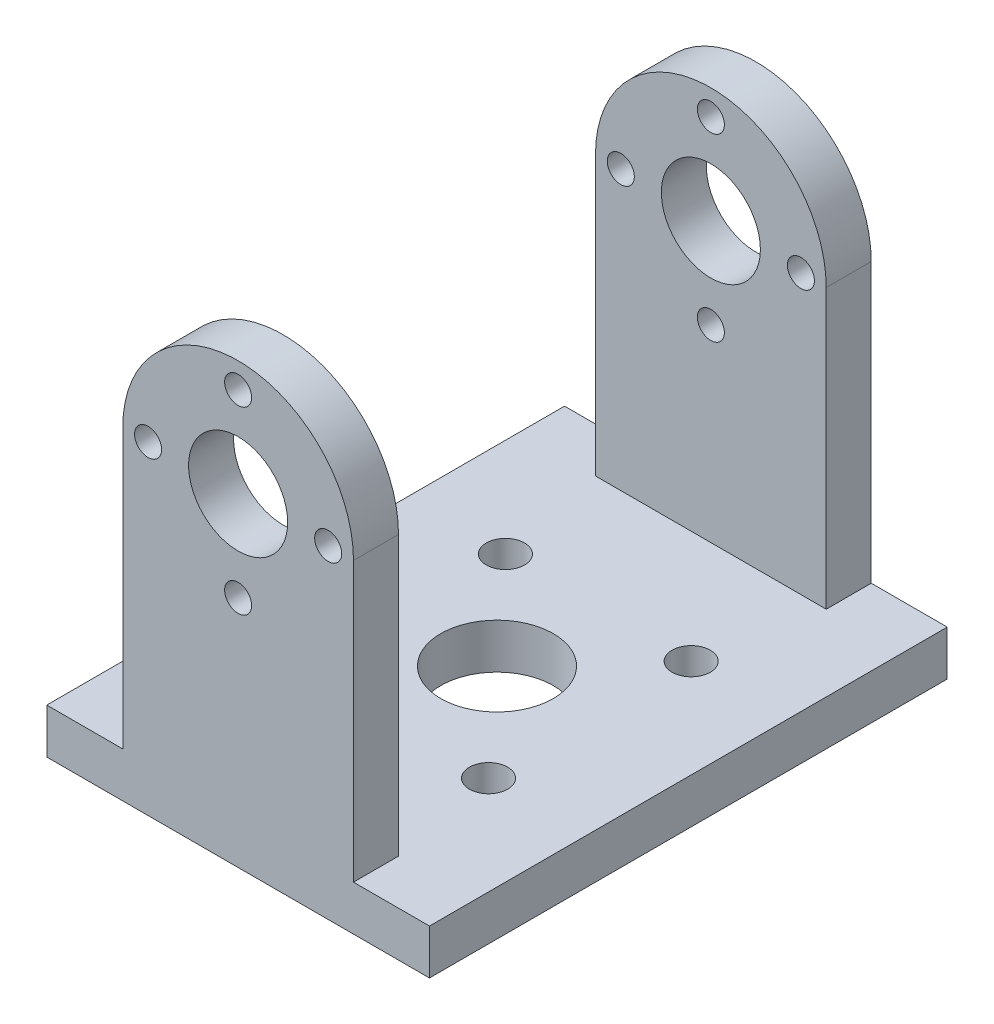
ISO-10303-21;
HEADER;
FILE_DESCRIPTION(('STEP AP214'),'2;1');
FILE_NAME('part.step','',(''),(''),'','','');
FILE_SCHEMA(('AUTOMOTIVE_DESIGN { 1 0 10303 214 1 1 1 1 }'));
ENDSEC;
DATA;
#1=APPLICATION_CONTEXT('core data for automotive mechanical design processes');
#2=APPLICATION_PROTOCOL_DEFINITION('international standard','automotive_design',2000,#1);
#3=PRODUCT_CONTEXT('',#1,'mechanical');
#4=PRODUCT('Part','Part','',(#3));
#5=PRODUCT_RELATED_PRODUCT_CATEGORY('part','',(#4));
#6=PRODUCT_DEFINITION_FORMATION('','',#4);
#7=PRODUCT_DEFINITION_CONTEXT('part definition',#1,'design');
#8=PRODUCT_DEFINITION('design','',#6,#7);
#9=PRODUCT_DEFINITION_SHAPE('','',#8);
#10=(LENGTH_UNIT() NAMED_UNIT(*) SI_UNIT(.MILLI.,.METRE.));
#11=(NAMED_UNIT(*) PLANE_ANGLE_UNIT() SI_UNIT($,.RADIAN.));
#12=(NAMED_UNIT(*) SI_UNIT($,.STERADIAN.) SOLID_ANGLE_UNIT());
#13=UNCERTAINTY_MEASURE_WITH_UNIT(LENGTH_MEASURE(1.E-05),#10,'distance_accuracy_value','');
#14=(GEOMETRIC_REPRESENTATION_CONTEXT(3) GLOBAL_UNCERTAINTY_ASSIGNED_CONTEXT((#13)) GLOBAL_UNIT_ASSIGNED_CONTEXT((#10,
#11,#12)) REPRESENTATION_CONTEXT('',''));
#15=CARTESIAN_POINT('',(0.,0.,0.));
#16=DIRECTION('',(0.,0.,1.));
#17=DIRECTION('',(1.,0.,0.));
#18=AXIS2_PLACEMENT_3D('',#15,#16,#17);
#19=CARTESIAN_POINT('',(0.,-24.75,0.));
#20=DIRECTION('',(0.,-1.,0.));
#21=DIRECTION('',(1.,0.,0.));
#22=AXIS2_PLACEMENT_3D('',#19,#20,#21);
#23=PLANE('',#22);
#24=CARTESIAN_POINT('',(0.,-24.75,23.));
#25=DIRECTION('',(0.,-1.,0.));
#26=DIRECTION('',(1.,0.,0.));
#27=AXIS2_PLACEMENT_3D('',#24,#25,#26);
#28=CIRCLE('',#27,5.);
#29=CARTESIAN_POINT('',(5.,-24.75,23.));
#30=VERTEX_POINT('',#29);
#31=EDGE_CURVE('E227',#30,#30,#28,.T.);
#32=ORIENTED_EDGE('',*,*,#31,.T.);
#33=EDGE_LOOP('',(#32));
#34=FACE_BOUND('',#33,.T.);
#35=CARTESIAN_POINT('',(8.25,-24.75,14.));
#36=DIRECTION('',(0.,-1.,0.));
#37=DIRECTION('',(1.,0.,0.));
#38=AXIS2_PLACEMENT_3D('',#35,#36,#37);
#39=CIRCLE('',#38,1.7);
#40=CARTESIAN_POINT('',(9.95,-24.75,14.));
#41=VERTEX_POINT('',#40);
#42=EDGE_CURVE('E219',#41,#41,#39,.T.);
#43=ORIENTED_EDGE('',*,*,#42,.T.);
#44=EDGE_LOOP('',(#43));
#45=FACE_BOUND('',#44,.T.);
#46=CARTESIAN_POINT('',(-8.25,-24.75,14.));
#47=DIRECTION('',(0.,-1.,0.));
#48=DIRECTION('',(1.,0.,0.));
#49=AXIS2_PLACEMENT_3D('',#46,#47,#48);
#50=CIRCLE('',#49,1.7);
#51=CARTESIAN_POINT('',(-6.55,-24.75,14.));
#52=VERTEX_POINT('',#51);
#53=EDGE_CURVE('E211',#52,#52,#50,.T.);
#54=ORIENTED_EDGE('',*,*,#53,.T.);
#55=EDGE_LOOP('',(#54));
#56=FACE_BOUND('',#55,.T.);
#57=CARTESIAN_POINT('',(-8.25000000000019,-24.75,32.));
#58=DIRECTION('',(0.,-1.,0.));
#59=DIRECTION('',(1.,0.,0.));
#60=AXIS2_PLACEMENT_3D('',#57,#58,#59);
#61=CIRCLE('',#60,1.7);
#62=CARTESIAN_POINT('',(-6.55000000000019,-24.75,32.));
#63=VERTEX_POINT('',#62);
#64=EDGE_CURVE('E203',#63,#63,#61,.T.);
#65=ORIENTED_EDGE('',*,*,#64,.T.);
#66=EDGE_LOOP('',(#65));
#67=FACE_BOUND('',#66,.T.);
#68=CARTESIAN_POINT('',(8.24999999999981,-24.75,32.));
#69=DIRECTION('',(0.,-1.,0.));
#70=DIRECTION('',(1.,0.,0.));
#71=AXIS2_PLACEMENT_3D('',#68,#69,#70);
#72=CIRCLE('',#71,1.7);
#73=CARTESIAN_POINT('',(9.94999999999981,-24.75,32.));
#74=VERTEX_POINT('',#73);
#75=EDGE_CURVE('E195',#74,#74,#72,.T.);
#76=ORIENTED_EDGE('',*,*,#75,.T.);
#77=EDGE_LOOP('',(#76));
#78=FACE_BOUND('',#77,.T.);
#79=DIRECTION('',(0.,0.,-1.));
#80=VECTOR('',#79,1.);
#81=CARTESIAN_POINT('',(10.25,-24.75,0.));
#82=LINE('',#81,#80);
#83=CARTESIAN_POINT('',(10.25,-24.75,46.));
#84=VERTEX_POINT('',#83);
#85=CARTESIAN_POINT('',(10.25,-24.75,42.));
#86=VERTEX_POINT('',#85);
#87=EDGE_CURVE('E11',#84,#86,#82,.T.);
#88=ORIENTED_EDGE('',*,*,#87,.F.);
#89=DIRECTION('',(-1.,0.,0.));
#90=VECTOR('',#89,1.);
#91=CARTESIAN_POINT('',(17.,-24.75,46.));
#92=LINE('',#91,#90);
#93=CARTESIAN_POINT('',(17.,-24.75,46.));
#94=VERTEX_POINT('',#93);
#95=EDGE_CURVE('E241',#94,#84,#92,.T.);
#96=ORIENTED_EDGE('',*,*,#95,.F.);
#97=DIRECTION('',(0.,0.,1.));
#98=VECTOR('',#97,1.);
#99=CARTESIAN_POINT('',(17.,-24.75,0.));
#100=LINE('',#99,#98);
#101=CARTESIAN_POINT('',(17.,-24.75,0.));
#102=VERTEX_POINT('',#101);
#103=EDGE_CURVE('E235',#102,#94,#100,.T.);
#104=ORIENTED_EDGE('',*,*,#103,.F.);
#105=DIRECTION('',(1.,0.,0.));
#106=VECTOR('',#105,1.);
#107=CARTESIAN_POINT('',(17.,-24.75,0.));
#108=LINE('',#107,#106);
#109=CARTESIAN_POINT('',(10.25,-24.75,0.));
#110=VERTEX_POINT('',#109);
#111=EDGE_CURVE('E249',#110,#102,#108,.T.);
#112=ORIENTED_EDGE('',*,*,#111,.F.);
#113=DIRECTION('',(0.,0.,-1.));
#114=VECTOR('',#113,1.);
#115=CARTESIAN_POINT('',(10.25,-24.75,4.));
#116=LINE('',#115,#114);
#117=CARTESIAN_POINT('',(10.25,-24.75,4.));
#118=VERTEX_POINT('',#117);
#119=EDGE_CURVE('E283',#118,#110,#116,.T.);
#120=ORIENTED_EDGE('',*,*,#119,.F.);
#121=DIRECTION('',(1.,0.,0.));
#122=VECTOR('',#121,1.);
#123=CARTESIAN_POINT('',(0.,-24.75,4.));
#124=LINE('',#123,#122);
#125=CARTESIAN_POINT('',(-10.25,-24.75,4.));
#126=VERTEX_POINT('',#125);
#127=EDGE_CURVE('E268',#126,#118,#124,.T.);
#128=ORIENTED_EDGE('',*,*,#127,.F.);
#129=DIRECTION('',(0.,0.,-1.));
#130=VECTOR('',#129,1.);
#131=CARTESIAN_POINT('',(-10.25,-24.75,4.));
#132=LINE('',#131,#130);
#133=CARTESIAN_POINT('',(-10.25,-24.75,0.));
#134=VERTEX_POINT('',#133);
#135=EDGE_CURVE('E71',#126,#134,#132,.T.);
#136=ORIENTED_EDGE('',*,*,#135,.T.);
#137=CARTESIAN_POINT('',(-17.,-24.75,0.));
#138=VERTEX_POINT('',#137);
#139=EDGE_CURVE('E250',#138,#134,#108,.T.);
#140=ORIENTED_EDGE('',*,*,#139,.F.);
#141=DIRECTION('',(0.,0.,-1.));
#142=VECTOR('',#141,1.);
#143=CARTESIAN_POINT('',(-17.,-24.75,0.));
#144=LINE('',#143,#142);
#145=CARTESIAN_POINT('',(-17.,-24.75,46.));
#146=VERTEX_POINT('',#145);
#147=EDGE_CURVE('E245',#146,#138,#144,.T.);
#148=ORIENTED_EDGE('',*,*,#147,.F.);
#149=CARTESIAN_POINT('',(-10.25,-24.75,46.));
#150=VERTEX_POINT('',#149);
#151=EDGE_CURVE('E239',#150,#146,#92,.T.);
#152=ORIENTED_EDGE('',*,*,#151,.F.);
#153=DIRECTION('',(0.,0.,-1.));
#154=VECTOR('',#153,1.);
#155=CARTESIAN_POINT('',(-10.25,-24.75,0.));
#156=LINE('',#155,#154);
#157=CARTESIAN_POINT('',(-10.25,-24.75,42.));
#158=VERTEX_POINT('',#157);
#159=EDGE_CURVE('E56',#150,#158,#156,.T.);
#160=ORIENTED_EDGE('',*,*,#159,.T.);
#161=DIRECTION('',(1.,0.,0.));
#162=VECTOR('',#161,1.);
#163=CARTESIAN_POINT('',(0.,-24.75,42.));
#164=LINE('',#163,#162);
#165=EDGE_CURVE('E154',#158,#86,#164,.T.);
#166=ORIENTED_EDGE('',*,*,#165,.T.);
#167=EDGE_LOOP('',(#88,#96,#104,#112,#120,#128,#136,#140,#148,#152,#160,#166));
#168=FACE_BOUND('',#167,.T.);
#169=ADVANCED_FACE('F47',(#34,#45,#56,#67,#78,#168),#23,.F.);
#170=CARTESIAN_POINT('',(10.25,0.,4.));
#171=DIRECTION('',(1.,0.,0.));
#172=DIRECTION('',(0.,1.,0.));
#173=AXIS2_PLACEMENT_3D('',#170,#171,#172);
#174=PLANE('',#173);
#175=DIRECTION('',(0.,-1.,0.));
#176=VECTOR('',#175,1.);
#177=CARTESIAN_POINT('',(10.25,0.,4.));
#178=LINE('',#177,#176);
#179=CARTESIAN_POINT('',(10.25,0.,4.));
#180=VERTEX_POINT('',#179);
#181=EDGE_CURVE('E308',#180,#118,#178,.T.);
#182=ORIENTED_EDGE('',*,*,#181,.T.);
#183=ORIENTED_EDGE('',*,*,#119,.T.);
#184=DIRECTION('',(0.,-1.,0.));
#185=VECTOR('',#184,1.);
#186=CARTESIAN_POINT('',(10.25,0.,0.));
#187=LINE('',#186,#185);
#188=CARTESIAN_POINT('',(10.25,0.,0.));
#189=VERTEX_POINT('',#188);
#190=EDGE_CURVE('E339',#189,#110,#187,.T.);
#191=ORIENTED_EDGE('',*,*,#190,.F.);
#192=DIRECTION('',(0.,0.,-1.));
#193=VECTOR('',#192,1.);
#194=CARTESIAN_POINT('',(10.25,0.,4.));
#195=LINE('',#194,#193);
#196=EDGE_CURVE('E355',#180,#189,#195,.T.);
#197=ORIENTED_EDGE('',*,*,#196,.F.);
#198=EDGE_LOOP('',(#182,#183,#191,#197));
#199=FACE_BOUND('',#198,.T.);
#200=ADVANCED_FACE('F399',(#199),#174,.T.);
#201=CARTESIAN_POINT('',(-10.25,0.,4.));
#202=DIRECTION('',(1.,0.,0.));
#203=DIRECTION('',(0.,1.,0.));
#204=AXIS2_PLACEMENT_3D('',#201,#202,#203);
#205=PLANE('',#204);
#206=ORIENTED_EDGE('',*,*,#135,.F.);
#207=DIRECTION('',(0.,-1.,0.));
#208=VECTOR('',#207,1.);
#209=CARTESIAN_POINT('',(-10.25,0.,4.));
#210=LINE('',#209,#208);
#211=CARTESIAN_POINT('',(-10.25,0.,4.));
#212=VERTEX_POINT('',#211);
#213=EDGE_CURVE('E316',#212,#126,#210,.T.);
#214=ORIENTED_EDGE('',*,*,#213,.F.);
#215=DIRECTION('',(0.,0.,-1.));
#216=VECTOR('',#215,1.);
#217=CARTESIAN_POINT('',(-10.25,0.,4.));
#218=LINE('',#217,#216);
#219=CARTESIAN_POINT('',(-10.25,0.,0.));
#220=VERTEX_POINT('',#219);
#221=EDGE_CURVE('E319',#212,#220,#218,.T.);
#222=ORIENTED_EDGE('',*,*,#221,.T.);
#223=DIRECTION('',(0.,-1.,0.));
#224=VECTOR('',#223,1.);
#225=CARTESIAN_POINT('',(-10.25,0.,0.));
#226=LINE('',#225,#224);
#227=EDGE_CURVE('E347',#220,#134,#226,.T.);
#228=ORIENTED_EDGE('',*,*,#227,.T.);
#229=EDGE_LOOP('',(#206,#214,#222,#228));
#230=FACE_BOUND('',#229,.T.);
#231=ADVANCED_FACE('F393',(#230),#205,.F.);
#232=CARTESIAN_POINT('',(0.,0.,4.));
#233=DIRECTION('',(0.,0.,1.));
#234=DIRECTION('',(1.,0.,0.));
#235=AXIS2_PLACEMENT_3D('',#232,#233,#234);
#236=PLANE('',#235);
#237=CARTESIAN_POINT('',(0.,-8.,4.));
#238=DIRECTION('',(0.,0.,1.));
#239=DIRECTION('',(1.,0.,0.));
#240=AXIS2_PLACEMENT_3D('',#237,#238,#239);
#241=CIRCLE('',#240,1.2);
#242=CARTESIAN_POINT('',(1.19999999999994,-8.,4.));
#243=VERTEX_POINT('',#242);
#244=EDGE_CURVE('E287',#243,#243,#241,.T.);
#245=ORIENTED_EDGE('',*,*,#244,.F.);
#246=EDGE_LOOP('',(#245));
#247=FACE_BOUND('',#246,.T.);
#248=CARTESIAN_POINT('',(8.,0.,4.));
#249=DIRECTION('',(0.,0.,1.));
#250=DIRECTION('',(1.,0.,0.));
#251=AXIS2_PLACEMENT_3D('',#248,#249,#250);
#252=CIRCLE('',#251,1.2);
#253=CARTESIAN_POINT('',(9.2,0.,4.));
#254=VERTEX_POINT('',#253);
#255=EDGE_CURVE('E291',#254,#254,#252,.T.);
#256=ORIENTED_EDGE('',*,*,#255,.F.);
#257=EDGE_LOOP('',(#256));
#258=FACE_BOUND('',#257,.T.);
#259=CARTESIAN_POINT('',(0.,8.,4.));
#260=DIRECTION('',(0.,0.,1.));
#261=DIRECTION('',(1.,0.,0.));
#262=AXIS2_PLACEMENT_3D('',#259,#260,#261);
#263=CIRCLE('',#262,1.2);
#264=CARTESIAN_POINT('',(1.2,8.,4.));
#265=VERTEX_POINT('',#264);
#266=EDGE_CURVE('E296',#265,#265,#263,.T.);
#267=ORIENTED_EDGE('',*,*,#266,.F.);
#268=EDGE_LOOP('',(#267));
#269=FACE_BOUND('',#268,.T.);
#270=CARTESIAN_POINT('',(0.,0.,4.));
#271=DIRECTION('',(0.,0.,1.));
#272=DIRECTION('',(1.,0.,0.));
#273=AXIS2_PLACEMENT_3D('',#270,#271,#272);
#274=CIRCLE('',#273,4.4);
#275=CARTESIAN_POINT('',(4.4,0.,4.));
#276=VERTEX_POINT('',#275);
#277=EDGE_CURVE('E300',#276,#276,#274,.T.);
#278=ORIENTED_EDGE('',*,*,#277,.F.);
#279=EDGE_LOOP('',(#278));
#280=FACE_BOUND('',#279,.T.);
#281=CARTESIAN_POINT('',(-8.,0.,4.));
#282=DIRECTION('',(0.,0.,1.));
#283=DIRECTION('',(1.,0.,0.));
#284=AXIS2_PLACEMENT_3D('',#281,#282,#283);
#285=CIRCLE('',#284,1.2);
#286=CARTESIAN_POINT('',(-6.8,0.,4.));
#287=VERTEX_POINT('',#286);
#288=EDGE_CURVE('E304',#287,#287,#285,.T.);
#289=ORIENTED_EDGE('',*,*,#288,.F.);
#290=EDGE_LOOP('',(#289));
#291=FACE_BOUND('',#290,.T.);
#292=ORIENTED_EDGE('',*,*,#213,.T.);
#293=ORIENTED_EDGE('',*,*,#127,.T.);
#294=ORIENTED_EDGE('',*,*,#181,.F.);
#295=CARTESIAN_POINT('',(0.,0.,4.));
#296=DIRECTION('',(0.,0.,1.));
#297=DIRECTION('',(1.,0.,0.));
#298=AXIS2_PLACEMENT_3D('',#295,#296,#297);
#299=CIRCLE('',#298,10.25);
#300=EDGE_CURVE('E312',#180,#212,#299,.T.);
#301=ORIENTED_EDGE('',*,*,#300,.T.);
#302=EDGE_LOOP('',(#292,#293,#294,#301));
#303=FACE_BOUND('',#302,.T.);
#304=ADVANCED_FACE('F401',(#247,#258,#269,#280,#291,#303),#236,.T.);
#305=CARTESIAN_POINT('',(0.,0.,4.));
#306=DIRECTION('',(0.,0.,-1.));
#307=DIRECTION('',(-1.,0.,0.));
#308=AXIS2_PLACEMENT_3D('',#305,#306,#307);
#309=CYLINDRICAL_SURFACE('',#308,10.25);
#310=CARTESIAN_POINT('',(0.,0.,0.));
#311=DIRECTION('',(0.,0.,1.));
#312=DIRECTION('',(1.,0.,0.));
#313=AXIS2_PLACEMENT_3D('',#310,#311,#312);
#314=CIRCLE('',#313,10.25);
#315=EDGE_CURVE('E343',#189,#220,#314,.T.);
#316=ORIENTED_EDGE('',*,*,#315,.T.);
#317=ORIENTED_EDGE('',*,*,#221,.F.);
#318=ORIENTED_EDGE('',*,*,#300,.F.);
#319=ORIENTED_EDGE('',*,*,#196,.T.);
#320=EDGE_LOOP('',(#316,#317,#318,#319));
#321=FACE_BOUND('',#320,.T.);
#322=ADVANCED_FACE('F396',(#321),#309,.T.);
#323=CARTESIAN_POINT('',(-8.,0.,4.));
#324=DIRECTION('',(0.,0.,-1.));
#325=DIRECTION('',(-1.,0.,0.));
#326=AXIS2_PLACEMENT_3D('',#323,#324,#325);
#327=CYLINDRICAL_SURFACE('',#326,1.2);
#328=ORIENTED_EDGE('',*,*,#288,.T.);
#329=EDGE_LOOP('',(#328));
#330=FACE_BOUND('',#329,.T.);
#331=CARTESIAN_POINT('',(-8.,0.,0.));
#332=DIRECTION('',(0.,0.,1.));
#333=DIRECTION('',(1.,0.,0.));
#334=AXIS2_PLACEMENT_3D('',#331,#332,#333);
#335=CIRCLE('',#334,1.2);
#336=CARTESIAN_POINT('',(-6.8,0.,0.));
#337=VERTEX_POINT('',#336);
#338=EDGE_CURVE('E335',#337,#337,#335,.T.);
#339=ORIENTED_EDGE('',*,*,#338,.F.);
#340=EDGE_LOOP('',(#339));
#341=FACE_BOUND('',#340,.T.);
#342=ADVANCED_FACE('F410',(#330,#341),#327,.F.);
#343=CARTESIAN_POINT('',(0.,0.,4.));
#344=DIRECTION('',(0.,0.,-1.));
#345=DIRECTION('',(-1.,0.,0.));
#346=AXIS2_PLACEMENT_3D('',#343,#344,#345);
#347=CYLINDRICAL_SURFACE('',#346,4.4);
#348=ORIENTED_EDGE('',*,*,#277,.T.);
#349=EDGE_LOOP('',(#348));
#350=FACE_BOUND('',#349,.T.);
#351=CARTESIAN_POINT('',(0.,0.,0.));
#352=DIRECTION('',(0.,0.,1.));
#353=DIRECTION('',(1.,0.,0.));
#354=AXIS2_PLACEMENT_3D('',#351,#352,#353);
#355=CIRCLE('',#354,4.4);
#356=CARTESIAN_POINT('',(4.4,0.,0.));
#357=VERTEX_POINT('',#356);
#358=EDGE_CURVE('E331',#357,#357,#355,.T.);
#359=ORIENTED_EDGE('',*,*,#358,.F.);
#360=EDGE_LOOP('',(#359));
#361=FACE_BOUND('',#360,.T.);
#362=ADVANCED_FACE('F443',(#350,#361),#347,.F.);
#363=CARTESIAN_POINT('',(0.,8.,4.));
#364=DIRECTION('',(0.,0.,-1.));
#365=DIRECTION('',(-1.,0.,0.));
#366=AXIS2_PLACEMENT_3D('',#363,#364,#365);
#367=CYLINDRICAL_SURFACE('',#366,1.2);
#368=ORIENTED_EDGE('',*,*,#266,.T.);
#369=EDGE_LOOP('',(#368));
#370=FACE_BOUND('',#369,.T.);
#371=CARTESIAN_POINT('',(0.,8.,0.));
#372=DIRECTION('',(0.,0.,1.));
#373=DIRECTION('',(1.,0.,0.));
#374=AXIS2_PLACEMENT_3D('',#371,#372,#373);
#375=CIRCLE('',#374,1.2);
#376=CARTESIAN_POINT('',(1.2,8.,0.));
#377=VERTEX_POINT('',#376);
#378=EDGE_CURVE('E327',#377,#377,#375,.T.);
#379=ORIENTED_EDGE('',*,*,#378,.F.);
#380=EDGE_LOOP('',(#379));
#381=FACE_BOUND('',#380,.T.);
#382=ADVANCED_FACE('F447',(#370,#381),#367,.F.);
#383=CARTESIAN_POINT('',(8.,0.,4.));
#384=DIRECTION('',(0.,0.,-1.));
#385=DIRECTION('',(-1.,0.,0.));
#386=AXIS2_PLACEMENT_3D('',#383,#384,#385);
#387=CYLINDRICAL_SURFACE('',#386,1.2);
#388=ORIENTED_EDGE('',*,*,#255,.T.);
#389=EDGE_LOOP('',(#388));
#390=FACE_BOUND('',#389,.T.);
#391=CARTESIAN_POINT('',(8.,0.,0.));
#392=DIRECTION('',(0.,0.,1.));
#393=DIRECTION('',(1.,0.,0.));
#394=AXIS2_PLACEMENT_3D('',#391,#392,#393);
#395=CIRCLE('',#394,1.2);
#396=CARTESIAN_POINT('',(9.2,0.,0.));
#397=VERTEX_POINT('',#396);
#398=EDGE_CURVE('E323',#397,#397,#395,.T.);
#399=ORIENTED_EDGE('',*,*,#398,.F.);
#400=EDGE_LOOP('',(#399));
#401=FACE_BOUND('',#400,.T.);
#402=ADVANCED_FACE('F450',(#390,#401),#387,.F.);
#403=CARTESIAN_POINT('',(0.,-8.,4.));
#404=DIRECTION('',(0.,0.,-1.));
#405=DIRECTION('',(-1.,0.,0.));
#406=AXIS2_PLACEMENT_3D('',#403,#404,#405);
#407=CYLINDRICAL_SURFACE('',#406,1.2);
#408=ORIENTED_EDGE('',*,*,#244,.T.);
#409=EDGE_LOOP('',(#408));
#410=FACE_BOUND('',#409,.T.);
#411=CARTESIAN_POINT('',(0.,-8.,0.));
#412=DIRECTION('',(0.,0.,1.));
#413=DIRECTION('',(1.,0.,0.));
#414=AXIS2_PLACEMENT_3D('',#411,#412,#413);
#415=CIRCLE('',#414,1.2);
#416=CARTESIAN_POINT('',(1.19999999999994,-8.,0.));
#417=VERTEX_POINT('',#416);
#418=EDGE_CURVE('E286',#417,#417,#415,.T.);
#419=ORIENTED_EDGE('',*,*,#418,.F.);
#420=EDGE_LOOP('',(#419));
#421=FACE_BOUND('',#420,.T.);
#422=ADVANCED_FACE('F49',(#410,#421),#407,.F.);
#423=CARTESIAN_POINT('',(0.,-28.75,4.));
#424=DIRECTION('',(0.,1.,0.));
#425=DIRECTION('',(-1.,0.,0.));
#426=AXIS2_PLACEMENT_3D('',#423,#424,#425);
#427=PLANE('',#426);
#428=DIRECTION('',(-1.,0.,0.));
#429=VECTOR('',#428,1.);
#430=CARTESIAN_POINT('',(17.,-28.75,46.));
#431=LINE('',#430,#429);
#432=CARTESIAN_POINT('',(17.,-28.75,46.));
#433=VERTEX_POINT('',#432);
#434=CARTESIAN_POINT('',(-17.,-28.75,46.));
#435=VERTEX_POINT('',#434);
#436=EDGE_CURVE('E258',#433,#435,#431,.T.);
#437=ORIENTED_EDGE('',*,*,#436,.T.);
#438=DIRECTION('',(0.,0.,-1.));
#439=VECTOR('',#438,1.);
#440=CARTESIAN_POINT('',(-17.,-28.75,0.));
#441=LINE('',#440,#439);
#442=CARTESIAN_POINT('',(-17.,-28.75,0.));
#443=VERTEX_POINT('',#442);
#444=EDGE_CURVE('E240',#435,#443,#441,.T.);
#445=ORIENTED_EDGE('',*,*,#444,.T.);
#446=DIRECTION('',(1.,0.,0.));
#447=VECTOR('',#446,1.);
#448=CARTESIAN_POINT('',(0.,-28.75,0.));
#449=LINE('',#448,#447);
#450=CARTESIAN_POINT('',(17.,-28.75,0.));
#451=VERTEX_POINT('',#450);
#452=EDGE_CURVE('E292',#443,#451,#449,.T.);
#453=ORIENTED_EDGE('',*,*,#452,.T.);
#454=DIRECTION('',(0.,0.,1.));
#455=VECTOR('',#454,1.);
#456=CARTESIAN_POINT('',(17.,-28.75,0.));
#457=LINE('',#456,#455);
#458=EDGE_CURVE('E231',#451,#433,#457,.T.);
#459=ORIENTED_EDGE('',*,*,#458,.T.);
#460=EDGE_LOOP('',(#437,#445,#453,#459));
#461=FACE_BOUND('',#460,.T.);
#462=CARTESIAN_POINT('',(0.,-28.75,23.));
#463=DIRECTION('',(0.,-1.,0.));
#464=DIRECTION('',(1.,0.,0.));
#465=AXIS2_PLACEMENT_3D('',#462,#463,#464);
#466=CIRCLE('',#465,5.);
#467=CARTESIAN_POINT('',(5.,-28.75,23.));
#468=VERTEX_POINT('',#467);
#469=EDGE_CURVE('E223',#468,#468,#466,.T.);
#470=ORIENTED_EDGE('',*,*,#469,.F.);
#471=EDGE_LOOP('',(#470));
#472=FACE_BOUND('',#471,.T.);
#473=CARTESIAN_POINT('',(8.25,-28.75,14.));
#474=DIRECTION('',(0.,-1.,0.));
#475=DIRECTION('',(1.,0.,0.));
#476=AXIS2_PLACEMENT_3D('',#473,#474,#475);
#477=CIRCLE('',#476,1.7);
#478=CARTESIAN_POINT('',(9.95,-28.75,14.));
#479=VERTEX_POINT('',#478);
#480=EDGE_CURVE('E215',#479,#479,#477,.T.);
#481=ORIENTED_EDGE('',*,*,#480,.F.);
#482=EDGE_LOOP('',(#481));
#483=FACE_BOUND('',#482,.T.);
#484=CARTESIAN_POINT('',(-8.25,-28.75,14.));
#485=DIRECTION('',(0.,-1.,0.));
#486=DIRECTION('',(1.,0.,0.));
#487=AXIS2_PLACEMENT_3D('',#484,#485,#486);
#488=CIRCLE('',#487,1.7);
#489=CARTESIAN_POINT('',(-6.55,-28.75,14.));
#490=VERTEX_POINT('',#489);
#491=EDGE_CURVE('E207',#490,#490,#488,.T.);
#492=ORIENTED_EDGE('',*,*,#491,.F.);
#493=EDGE_LOOP('',(#492));
#494=FACE_BOUND('',#493,.T.);
#495=CARTESIAN_POINT('',(-8.25000000000019,-28.75,32.));
#496=DIRECTION('',(0.,-1.,0.));
#497=DIRECTION('',(1.,0.,0.));
#498=AXIS2_PLACEMENT_3D('',#495,#496,#497);
#499=CIRCLE('',#498,1.7);
#500=CARTESIAN_POINT('',(-6.55000000000019,-28.75,32.));
#501=VERTEX_POINT('',#500);
#502=EDGE_CURVE('E199',#501,#501,#499,.T.);
#503=ORIENTED_EDGE('',*,*,#502,.F.);
#504=EDGE_LOOP('',(#503));
#505=FACE_BOUND('',#504,.T.);
#506=CARTESIAN_POINT('',(8.24999999999981,-28.75,32.));
#507=DIRECTION('',(0.,-1.,0.));
#508=DIRECTION('',(1.,0.,0.));
#509=AXIS2_PLACEMENT_3D('',#506,#507,#508);
#510=CIRCLE('',#509,1.7);
#511=CARTESIAN_POINT('',(9.94999999999981,-28.75,32.));
#512=VERTEX_POINT('',#511);
#513=EDGE_CURVE('E145',#512,#512,#510,.T.);
#514=ORIENTED_EDGE('',*,*,#513,.F.);
#515=EDGE_LOOP('',(#514));
#516=FACE_BOUND('',#515,.T.);
#517=ADVANCED_FACE('F387',(#461,#472,#483,#494,#505,#516),#427,.F.);
#518=CARTESIAN_POINT('',(0.,0.,0.));
#519=DIRECTION('',(0.,0.,1.));
#520=DIRECTION('',(1.,0.,0.));
#521=AXIS2_PLACEMENT_3D('',#518,#519,#520);
#522=PLANE('',#521);
#523=ORIENTED_EDGE('',*,*,#452,.F.);
#524=DIRECTION('',(0.,-1.,0.));
#525=VECTOR('',#524,1.);
#526=CARTESIAN_POINT('',(-17.,-24.75,0.));
#527=LINE('',#526,#525);
#528=EDGE_CURVE('E269',#138,#443,#527,.T.);
#529=ORIENTED_EDGE('',*,*,#528,.F.);
#530=ORIENTED_EDGE('',*,*,#139,.T.);
#531=ORIENTED_EDGE('',*,*,#227,.F.);
#532=ORIENTED_EDGE('',*,*,#315,.F.);
#533=ORIENTED_EDGE('',*,*,#190,.T.);
#534=ORIENTED_EDGE('',*,*,#111,.T.);
#535=DIRECTION('',(0.,-1.,0.));
#536=VECTOR('',#535,1.);
#537=CARTESIAN_POINT('',(17.,-24.75,0.));
#538=LINE('',#537,#536);
#539=EDGE_CURVE('E264',#102,#451,#538,.T.);
#540=ORIENTED_EDGE('',*,*,#539,.T.);
#541=EDGE_LOOP('',(#523,#529,#530,#531,#532,#533,#534,#540));
#542=FACE_BOUND('',#541,.T.);
#543=ORIENTED_EDGE('',*,*,#338,.T.);
#544=EDGE_LOOP('',(#543));
#545=FACE_BOUND('',#544,.T.);
#546=ORIENTED_EDGE('',*,*,#358,.T.);
#547=EDGE_LOOP('',(#546));
#548=FACE_BOUND('',#547,.T.);
#549=ORIENTED_EDGE('',*,*,#378,.T.);
#550=EDGE_LOOP('',(#549));
#551=FACE_BOUND('',#550,.T.);
#552=ORIENTED_EDGE('',*,*,#398,.T.);
#553=EDGE_LOOP('',(#552));
#554=FACE_BOUND('',#553,.T.);
#555=ORIENTED_EDGE('',*,*,#418,.T.);
#556=EDGE_LOOP('',(#555));
#557=FACE_BOUND('',#556,.T.);
#558=ADVANCED_FACE('F371',(#542,#545,#548,#551,#554,#557),#522,.F.);
#559=CARTESIAN_POINT('',(17.,-24.75,0.));
#560=DIRECTION('',(1.,0.,0.));
#561=DIRECTION('',(0.,0.,-1.));
#562=AXIS2_PLACEMENT_3D('',#559,#560,#561);
#563=PLANE('',#562);
#564=ORIENTED_EDGE('',*,*,#458,.F.);
#565=ORIENTED_EDGE('',*,*,#539,.F.);
#566=ORIENTED_EDGE('',*,*,#103,.T.);
#567=DIRECTION('',(0.,-1.,0.));
#568=VECTOR('',#567,1.);
#569=CARTESIAN_POINT('',(17.,-24.75,46.));
#570=LINE('',#569,#568);
#571=EDGE_CURVE('E254',#94,#433,#570,.T.);
#572=ORIENTED_EDGE('',*,*,#571,.T.);
#573=EDGE_LOOP('',(#564,#565,#566,#572));
#574=FACE_BOUND('',#573,.T.);
#575=ADVANCED_FACE('F379',(#574),#563,.T.);
#576=CARTESIAN_POINT('',(-17.,-24.75,0.));
#577=DIRECTION('',(-1.,0.,0.));
#578=DIRECTION('',(0.,0.,1.));
#579=AXIS2_PLACEMENT_3D('',#576,#577,#578);
#580=PLANE('',#579);
#581=ORIENTED_EDGE('',*,*,#444,.F.);
#582=DIRECTION('',(0.,-1.,0.));
#583=VECTOR('',#582,1.);
#584=CARTESIAN_POINT('',(-17.,-24.75,46.));
#585=LINE('',#584,#583);
#586=EDGE_CURVE('E273',#146,#435,#585,.T.);
#587=ORIENTED_EDGE('',*,*,#586,.F.);
#588=ORIENTED_EDGE('',*,*,#147,.T.);
#589=ORIENTED_EDGE('',*,*,#528,.T.);
#590=EDGE_LOOP('',(#581,#587,#588,#589));
#591=FACE_BOUND('',#590,.T.);
#592=ADVANCED_FACE('F390',(#591),#580,.T.);
#593=CARTESIAN_POINT('',(17.,-24.75,46.));
#594=DIRECTION('',(0.,0.,1.));
#595=DIRECTION('',(1.,0.,0.));
#596=AXIS2_PLACEMENT_3D('',#593,#594,#595);
#597=PLANE('',#596);
#598=ORIENTED_EDGE('',*,*,#586,.T.);
#599=ORIENTED_EDGE('',*,*,#436,.F.);
#600=ORIENTED_EDGE('',*,*,#571,.F.);
#601=ORIENTED_EDGE('',*,*,#95,.T.);
#602=DIRECTION('',(0.,-1.,0.));
#603=VECTOR('',#602,1.);
#604=CARTESIAN_POINT('',(10.25,0.,46.));
#605=LINE('',#604,#603);
#606=CARTESIAN_POINT('',(10.25,0.,46.));
#607=VERTEX_POINT('',#606);
#608=EDGE_CURVE('E186',#607,#84,#605,.T.);
#609=ORIENTED_EDGE('',*,*,#608,.F.);
#610=CARTESIAN_POINT('',(0.,0.,46.));
#611=DIRECTION('',(0.,0.,1.));
#612=DIRECTION('',(1.,0.,0.));
#613=AXIS2_PLACEMENT_3D('',#610,#611,#612);
#614=CIRCLE('',#613,10.25);
#615=CARTESIAN_POINT('',(-10.25,0.,46.));
#616=VERTEX_POINT('',#615);
#617=EDGE_CURVE('E191',#607,#616,#614,.T.);
#618=ORIENTED_EDGE('',*,*,#617,.T.);
#619=DIRECTION('',(0.,-1.,0.));
#620=VECTOR('',#619,1.);
#621=CARTESIAN_POINT('',(-10.25,0.,46.));
#622=LINE('',#621,#620);
#623=EDGE_CURVE('E63',#616,#150,#622,.T.);
#624=ORIENTED_EDGE('',*,*,#623,.T.);
#625=ORIENTED_EDGE('',*,*,#151,.T.);
#626=EDGE_LOOP('',(#598,#599,#600,#601,#609,#618,#624,#625));
#627=FACE_BOUND('',#626,.T.);
#628=CARTESIAN_POINT('',(0.,-8.,46.));
#629=DIRECTION('',(0.,0.,1.));
#630=DIRECTION('',(1.,0.,0.));
#631=AXIS2_PLACEMENT_3D('',#628,#629,#630);
#632=CIRCLE('',#631,1.2);
#633=CARTESIAN_POINT('',(1.19999999999994,-8.,46.));
#634=VERTEX_POINT('',#633);
#635=EDGE_CURVE('E166',#634,#634,#632,.T.);
#636=ORIENTED_EDGE('',*,*,#635,.F.);
#637=EDGE_LOOP('',(#636));
#638=FACE_BOUND('',#637,.T.);
#639=CARTESIAN_POINT('',(8.,0.,46.));
#640=DIRECTION('',(0.,0.,1.));
#641=DIRECTION('',(1.,0.,0.));
#642=AXIS2_PLACEMENT_3D('',#639,#640,#641);
#643=CIRCLE('',#642,1.2);
#644=CARTESIAN_POINT('',(9.2,0.,46.));
#645=VERTEX_POINT('',#644);
#646=EDGE_CURVE('E170',#645,#645,#643,.T.);
#647=ORIENTED_EDGE('',*,*,#646,.F.);
#648=EDGE_LOOP('',(#647));
#649=FACE_BOUND('',#648,.T.);
#650=CARTESIAN_POINT('',(0.,8.,46.));
#651=DIRECTION('',(0.,0.,1.));
#652=DIRECTION('',(1.,0.,0.));
#653=AXIS2_PLACEMENT_3D('',#650,#651,#652);
#654=CIRCLE('',#653,1.2);
#655=CARTESIAN_POINT('',(1.2,8.,46.));
#656=VERTEX_POINT('',#655);
#657=EDGE_CURVE('E174',#656,#656,#654,.T.);
#658=ORIENTED_EDGE('',*,*,#657,.F.);
#659=EDGE_LOOP('',(#658));
#660=FACE_BOUND('',#659,.T.);
#661=CARTESIAN_POINT('',(0.,0.,46.));
#662=DIRECTION('',(0.,0.,1.));
#663=DIRECTION('',(1.,0.,0.));
#664=AXIS2_PLACEMENT_3D('',#661,#662,#663);
#665=CIRCLE('',#664,4.4);
#666=CARTESIAN_POINT('',(4.4,0.,46.));
#667=VERTEX_POINT('',#666);
#668=EDGE_CURVE('E178',#667,#667,#665,.T.);
#669=ORIENTED_EDGE('',*,*,#668,.F.);
#670=EDGE_LOOP('',(#669));
#671=FACE_BOUND('',#670,.T.);
#672=CARTESIAN_POINT('',(-8.,0.,46.));
#673=DIRECTION('',(0.,0.,1.));
#674=DIRECTION('',(1.,0.,0.));
#675=AXIS2_PLACEMENT_3D('',#672,#673,#674);
#676=CIRCLE('',#675,1.2);
#677=CARTESIAN_POINT('',(-6.8,0.,46.));
#678=VERTEX_POINT('',#677);
#679=EDGE_CURVE('E182',#678,#678,#676,.T.);
#680=ORIENTED_EDGE('',*,*,#679,.F.);
#681=EDGE_LOOP('',(#680));
#682=FACE_BOUND('',#681,.T.);
#683=ADVANCED_FACE('F382',(#627,#638,#649,#660,#671,#682),#597,.T.);
#684=CARTESIAN_POINT('',(0.,-24.75,23.));
#685=DIRECTION('',(0.,-1.,0.));
#686=DIRECTION('',(1.,0.,0.));
#687=AXIS2_PLACEMENT_3D('',#684,#685,#686);
#688=CYLINDRICAL_SURFACE('',#687,5.);
#689=ORIENTED_EDGE('',*,*,#31,.F.);
#690=EDGE_LOOP('',(#689));
#691=FACE_BOUND('',#690,.T.);
#692=ORIENTED_EDGE('',*,*,#469,.T.);
#693=EDGE_LOOP('',(#692));
#694=FACE_BOUND('',#693,.T.);
#695=ADVANCED_FACE('F429',(#691,#694),#688,.F.);
#696=CARTESIAN_POINT('',(8.25,-24.75,14.));
#697=DIRECTION('',(0.,-1.,0.));
#698=DIRECTION('',(1.,0.,0.));
#699=AXIS2_PLACEMENT_3D('',#696,#697,#698);
#700=CYLINDRICAL_SURFACE('',#699,1.7);
#701=ORIENTED_EDGE('',*,*,#42,.F.);
#702=EDGE_LOOP('',(#701));
#703=FACE_BOUND('',#702,.T.);
#704=ORIENTED_EDGE('',*,*,#480,.T.);
#705=EDGE_LOOP('',(#704));
#706=FACE_BOUND('',#705,.T.);
#707=ADVANCED_FACE('F575',(#703,#706),#700,.F.);
#708=CARTESIAN_POINT('',(-8.25,-24.75,14.));
#709=DIRECTION('',(0.,-1.,0.));
#710=DIRECTION('',(1.,0.,0.));
#711=AXIS2_PLACEMENT_3D('',#708,#709,#710);
#712=CYLINDRICAL_SURFACE('',#711,1.7);
#713=ORIENTED_EDGE('',*,*,#53,.F.);
#714=EDGE_LOOP('',(#713));
#715=FACE_BOUND('',#714,.T.);
#716=ORIENTED_EDGE('',*,*,#491,.T.);
#717=EDGE_LOOP('',(#716));
#718=FACE_BOUND('',#717,.T.);
#719=ADVANCED_FACE('F584',(#715,#718),#712,.F.);
#720=CARTESIAN_POINT('',(-8.25000000000019,-24.75,32.));
#721=DIRECTION('',(0.,-1.,0.));
#722=DIRECTION('',(1.,0.,0.));
#723=AXIS2_PLACEMENT_3D('',#720,#721,#722);
#724=CYLINDRICAL_SURFACE('',#723,1.7);
#725=ORIENTED_EDGE('',*,*,#64,.F.);
#726=EDGE_LOOP('',(#725));
#727=FACE_BOUND('',#726,.T.);
#728=ORIENTED_EDGE('',*,*,#502,.T.);
#729=EDGE_LOOP('',(#728));
#730=FACE_BOUND('',#729,.T.);
#731=ADVANCED_FACE('F593',(#727,#730),#724,.F.);
#732=CARTESIAN_POINT('',(8.24999999999981,-24.75,32.));
#733=DIRECTION('',(0.,-1.,0.));
#734=DIRECTION('',(1.,0.,0.));
#735=AXIS2_PLACEMENT_3D('',#732,#733,#734);
#736=CYLINDRICAL_SURFACE('',#735,1.7);
#737=ORIENTED_EDGE('',*,*,#75,.F.);
#738=EDGE_LOOP('',(#737));
#739=FACE_BOUND('',#738,.T.);
#740=ORIENTED_EDGE('',*,*,#513,.T.);
#741=EDGE_LOOP('',(#740));
#742=FACE_BOUND('',#741,.T.);
#743=ADVANCED_FACE('F603',(#739,#742),#736,.F.);
#744=CARTESIAN_POINT('',(10.25,0.,42.));
#745=DIRECTION('',(-1.,0.,0.));
#746=DIRECTION('',(0.,-1.,0.));
#747=AXIS2_PLACEMENT_3D('',#744,#745,#746);
#748=PLANE('',#747);
#749=ORIENTED_EDGE('',*,*,#608,.T.);
#750=ORIENTED_EDGE('',*,*,#87,.T.);
#751=DIRECTION('',(0.,-1.,0.));
#752=VECTOR('',#751,1.);
#753=CARTESIAN_POINT('',(10.25,0.,42.));
#754=LINE('',#753,#752);
#755=CARTESIAN_POINT('',(10.25,0.,42.));
#756=VERTEX_POINT('',#755);
#757=EDGE_CURVE('E156',#756,#86,#754,.T.);
#758=ORIENTED_EDGE('',*,*,#757,.F.);
#759=DIRECTION('',(0.,0.,1.));
#760=VECTOR('',#759,1.);
#761=CARTESIAN_POINT('',(10.25,0.,42.));
#762=LINE('',#761,#760);
#763=EDGE_CURVE('E146',#756,#607,#762,.T.);
#764=ORIENTED_EDGE('',*,*,#763,.T.);
#765=EDGE_LOOP('',(#749,#750,#758,#764));
#766=FACE_BOUND('',#765,.T.);
#767=ADVANCED_FACE('F611',(#766),#748,.F.);
#768=CARTESIAN_POINT('',(-10.25,0.,42.));
#769=DIRECTION('',(-1.,0.,0.));
#770=DIRECTION('',(0.,-1.,0.));
#771=AXIS2_PLACEMENT_3D('',#768,#769,#770);
#772=PLANE('',#771);
#773=ORIENTED_EDGE('',*,*,#159,.F.);
#774=ORIENTED_EDGE('',*,*,#623,.F.);
#775=DIRECTION('',(0.,0.,1.));
#776=VECTOR('',#775,1.);
#777=CARTESIAN_POINT('',(-10.25,0.,42.));
#778=LINE('',#777,#776);
#779=CARTESIAN_POINT('',(-10.25,0.,42.));
#780=VERTEX_POINT('',#779);
#781=EDGE_CURVE('E136',#780,#616,#778,.T.);
#782=ORIENTED_EDGE('',*,*,#781,.F.);
#783=DIRECTION('',(0.,-1.,0.));
#784=VECTOR('',#783,1.);
#785=CARTESIAN_POINT('',(-10.25,0.,42.));
#786=LINE('',#785,#784);
#787=EDGE_CURVE('E139',#780,#158,#786,.T.);
#788=ORIENTED_EDGE('',*,*,#787,.T.);
#789=EDGE_LOOP('',(#773,#774,#782,#788));
#790=FACE_BOUND('',#789,.T.);
#791=ADVANCED_FACE('F138',(#790),#772,.T.);
#792=CARTESIAN_POINT('',(0.,0.,42.));
#793=DIRECTION('',(0.,0.,-1.));
#794=DIRECTION('',(1.,0.,0.));
#795=AXIS2_PLACEMENT_3D('',#792,#793,#794);
#796=PLANE('',#795);
#797=CARTESIAN_POINT('',(-8.,0.,42.));
#798=DIRECTION('',(0.,0.,1.));
#799=DIRECTION('',(1.,0.,0.));
#800=AXIS2_PLACEMENT_3D('',#797,#798,#799);
#801=CIRCLE('',#800,1.2);
#802=CARTESIAN_POINT('',(-6.8,0.,42.));
#803=VERTEX_POINT('',#802);
#804=EDGE_CURVE('E741',#803,#803,#801,.T.);
#805=ORIENTED_EDGE('',*,*,#804,.T.);
#806=EDGE_LOOP('',(#805));
#807=FACE_BOUND('',#806,.T.);
#808=CARTESIAN_POINT('',(0.,0.,42.));
#809=DIRECTION('',(0.,0.,1.));
#810=DIRECTION('',(1.,0.,0.));
#811=AXIS2_PLACEMENT_3D('',#808,#809,#810);
#812=CIRCLE('',#811,4.4);
#813=CARTESIAN_POINT('',(4.4,0.,42.));
#814=VERTEX_POINT('',#813);
#815=EDGE_CURVE('E737',#814,#814,#812,.T.);
#816=ORIENTED_EDGE('',*,*,#815,.T.);
#817=EDGE_LOOP('',(#816));
#818=FACE_BOUND('',#817,.T.);
#819=CARTESIAN_POINT('',(0.,8.,42.));
#820=DIRECTION('',(0.,0.,1.));
#821=DIRECTION('',(1.,0.,0.));
#822=AXIS2_PLACEMENT_3D('',#819,#820,#821);
#823=CIRCLE('',#822,1.2);
#824=CARTESIAN_POINT('',(1.2,8.,42.));
#825=VERTEX_POINT('',#824);
#826=EDGE_CURVE('E731',#825,#825,#823,.T.);
#827=ORIENTED_EDGE('',*,*,#826,.T.);
#828=EDGE_LOOP('',(#827));
#829=FACE_BOUND('',#828,.T.);
#830=CARTESIAN_POINT('',(8.,0.,42.));
#831=DIRECTION('',(0.,0.,1.));
#832=DIRECTION('',(1.,0.,0.));
#833=AXIS2_PLACEMENT_3D('',#830,#831,#832);
#834=CIRCLE('',#833,1.2);
#835=CARTESIAN_POINT('',(9.2,0.,42.));
#836=VERTEX_POINT('',#835);
#837=EDGE_CURVE('E727',#836,#836,#834,.T.);
#838=ORIENTED_EDGE('',*,*,#837,.T.);
#839=EDGE_LOOP('',(#838));
#840=FACE_BOUND('',#839,.T.);
#841=CARTESIAN_POINT('',(0.,-8.,42.));
#842=DIRECTION('',(0.,0.,1.));
#843=DIRECTION('',(1.,0.,0.));
#844=AXIS2_PLACEMENT_3D('',#841,#842,#843);
#845=CIRCLE('',#844,1.2);
#846=CARTESIAN_POINT('',(1.19999999999994,-8.,42.));
#847=VERTEX_POINT('',#846);
#848=EDGE_CURVE('E193',#847,#847,#845,.T.);
#849=ORIENTED_EDGE('',*,*,#848,.T.);
#850=EDGE_LOOP('',(#849));
#851=FACE_BOUND('',#850,.T.);
#852=ORIENTED_EDGE('',*,*,#165,.F.);
#853=ORIENTED_EDGE('',*,*,#787,.F.);
#854=CARTESIAN_POINT('',(0.,0.,42.));
#855=DIRECTION('',(0.,0.,1.));
#856=DIRECTION('',(1.,0.,0.));
#857=AXIS2_PLACEMENT_3D('',#854,#855,#856);
#858=CIRCLE('',#857,10.25);
#859=EDGE_CURVE('E152',#756,#780,#858,.T.);
#860=ORIENTED_EDGE('',*,*,#859,.F.);
#861=ORIENTED_EDGE('',*,*,#757,.T.);
#862=EDGE_LOOP('',(#852,#853,#860,#861));
#863=FACE_BOUND('',#862,.T.);
#864=ADVANCED_FACE('F150',(#807,#818,#829,#840,#851,#863),#796,.T.);
#865=CARTESIAN_POINT('',(-8.,0.,42.));
#866=DIRECTION('',(0.,0.,1.));
#867=DIRECTION('',(1.,0.,0.));
#868=AXIS2_PLACEMENT_3D('',#865,#866,#867);
#869=CYLINDRICAL_SURFACE('',#868,1.2);
#870=ORIENTED_EDGE('',*,*,#804,.F.);
#871=EDGE_LOOP('',(#870));
#872=FACE_BOUND('',#871,.T.);
#873=ORIENTED_EDGE('',*,*,#679,.T.);
#874=EDGE_LOOP('',(#873));
#875=FACE_BOUND('',#874,.T.);
#876=ADVANCED_FACE('F639',(#872,#875),#869,.F.);
#877=CARTESIAN_POINT('',(0.,0.,42.));
#878=DIRECTION('',(0.,0.,1.));
#879=DIRECTION('',(1.,0.,0.));
#880=AXIS2_PLACEMENT_3D('',#877,#878,#879);
#881=CYLINDRICAL_SURFACE('',#880,4.4);
#882=ORIENTED_EDGE('',*,*,#815,.F.);
#883=EDGE_LOOP('',(#882));
#884=FACE_BOUND('',#883,.T.);
#885=ORIENTED_EDGE('',*,*,#668,.T.);
#886=EDGE_LOOP('',(#885));
#887=FACE_BOUND('',#886,.T.);
#888=ADVANCED_FACE('F649',(#884,#887),#881,.F.);
#889=CARTESIAN_POINT('',(0.,8.,42.));
#890=DIRECTION('',(0.,0.,1.));
#891=DIRECTION('',(1.,0.,0.));
#892=AXIS2_PLACEMENT_3D('',#889,#890,#891);
#893=CYLINDRICAL_SURFACE('',#892,1.2);
#894=ORIENTED_EDGE('',*,*,#826,.F.);
#895=EDGE_LOOP('',(#894));
#896=FACE_BOUND('',#895,.T.);
#897=ORIENTED_EDGE('',*,*,#657,.T.);
#898=EDGE_LOOP('',(#897));
#899=FACE_BOUND('',#898,.T.);
#900=ADVANCED_FACE('F658',(#896,#899),#893,.F.);
#901=CARTESIAN_POINT('',(8.,0.,42.));
#902=DIRECTION('',(0.,0.,1.));
#903=DIRECTION('',(1.,0.,0.));
#904=AXIS2_PLACEMENT_3D('',#901,#902,#903);
#905=CYLINDRICAL_SURFACE('',#904,1.2);
#906=ORIENTED_EDGE('',*,*,#837,.F.);
#907=EDGE_LOOP('',(#906));
#908=FACE_BOUND('',#907,.T.);
#909=ORIENTED_EDGE('',*,*,#646,.T.);
#910=EDGE_LOOP('',(#909));
#911=FACE_BOUND('',#910,.T.);
#912=ADVANCED_FACE('F667',(#908,#911),#905,.F.);
#913=CARTESIAN_POINT('',(0.,-8.,42.));
#914=DIRECTION('',(0.,0.,1.));
#915=DIRECTION('',(1.,0.,0.));
#916=AXIS2_PLACEMENT_3D('',#913,#914,#915);
#917=CYLINDRICAL_SURFACE('',#916,1.2);
#918=ORIENTED_EDGE('',*,*,#848,.F.);
#919=EDGE_LOOP('',(#918));
#920=FACE_BOUND('',#919,.T.);
#921=ORIENTED_EDGE('',*,*,#635,.T.);
#922=EDGE_LOOP('',(#921));
#923=FACE_BOUND('',#922,.T.);
#924=ADVANCED_FACE('F676',(#920,#923),#917,.F.);
#925=CARTESIAN_POINT('',(0.,0.,42.));
#926=DIRECTION('',(0.,0.,1.));
#927=DIRECTION('',(1.,0.,0.));
#928=AXIS2_PLACEMENT_3D('',#925,#926,#927);
#929=CYLINDRICAL_SURFACE('',#928,10.25);
#930=ORIENTED_EDGE('',*,*,#617,.F.);
#931=ORIENTED_EDGE('',*,*,#763,.F.);
#932=ORIENTED_EDGE('',*,*,#859,.T.);
#933=ORIENTED_EDGE('',*,*,#781,.T.);
#934=EDGE_LOOP('',(#930,#931,#932,#933));
#935=FACE_BOUND('',#934,.T.);
#936=ADVANCED_FACE('F158',(#935),#929,.T.);
#937=CLOSED_SHELL('',(#169,#200,#231,#304,#322,#342,#362,#382,#402,#422,#517,#558,#575,#592,
#683,#695,#707,#719,#731,#743,#767,#791,#864,#876,#888,#900,#912,#924,#936));
#938=MANIFOLD_SOLID_BREP('B2',#937);
#939=ADVANCED_BREP_SHAPE_REPRESENTATION('',(#18,#938),#14);
#940=SHAPE_DEFINITION_REPRESENTATION(#9,#939);
ENDSEC;
END-ISO-10303-21;
